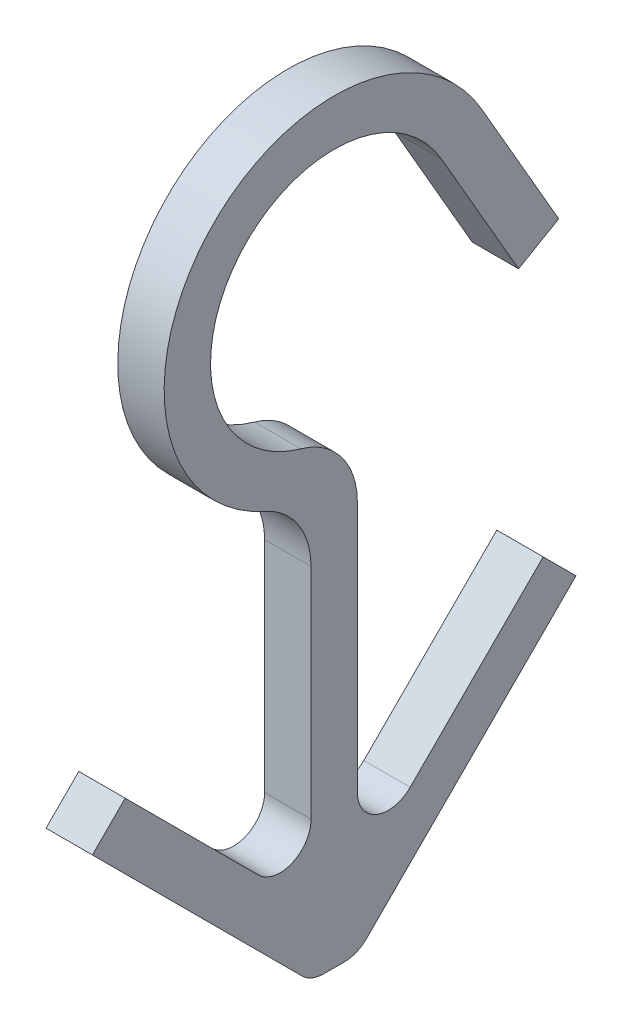
ISO-10303-21;
HEADER;
FILE_DESCRIPTION(('STEP AP214'),'2;1');
FILE_NAME('part.step','',(''),(''),'','','');
FILE_SCHEMA(('AUTOMOTIVE_DESIGN { 1 0 10303 214 1 1 1 1 }'));
ENDSEC;
DATA;
#1=APPLICATION_CONTEXT('core data for automotive mechanical design processes');
#2=APPLICATION_PROTOCOL_DEFINITION('international standard','automotive_design',2000,#1);
#3=PRODUCT_CONTEXT('',#1,'mechanical');
#4=PRODUCT('Part','Part','',(#3));
#5=PRODUCT_RELATED_PRODUCT_CATEGORY('part','',(#4));
#6=PRODUCT_DEFINITION_FORMATION('','',#4);
#7=PRODUCT_DEFINITION_CONTEXT('part definition',#1,'design');
#8=PRODUCT_DEFINITION('design','',#6,#7);
#9=PRODUCT_DEFINITION_SHAPE('','',#8);
#10=(LENGTH_UNIT() NAMED_UNIT(*) SI_UNIT(.MILLI.,.METRE.));
#11=(NAMED_UNIT(*) PLANE_ANGLE_UNIT() SI_UNIT($,.RADIAN.));
#12=(NAMED_UNIT(*) SI_UNIT($,.STERADIAN.) SOLID_ANGLE_UNIT());
#13=UNCERTAINTY_MEASURE_WITH_UNIT(LENGTH_MEASURE(1.E-05),#10,'distance_accuracy_value','');
#14=(GEOMETRIC_REPRESENTATION_CONTEXT(3) GLOBAL_UNCERTAINTY_ASSIGNED_CONTEXT((#13)) GLOBAL_UNIT_ASSIGNED_CONTEXT((#10,
#11,#12)) REPRESENTATION_CONTEXT('',''));
#15=CARTESIAN_POINT('',(0.,0.,0.));
#16=DIRECTION('',(0.,0.,1.));
#17=DIRECTION('',(1.,0.,0.));
#18=AXIS2_PLACEMENT_3D('',#15,#16,#17);
#19=CARTESIAN_POINT('',(6.,0.,0.));
#20=DIRECTION('',(-1.,0.,0.));
#21=DIRECTION('',(0.,0.,1.));
#22=AXIS2_PLACEMENT_3D('',#19,#20,#21);
#23=CYLINDRICAL_SURFACE('',#22,22.);
#24=CARTESIAN_POINT('',(0.,0.,0.));
#25=DIRECTION('',(1.,0.,0.));
#26=DIRECTION('',(0.,0.,-1.));
#27=AXIS2_PLACEMENT_3D('',#24,#25,#26);
#28=CIRCLE('',#27,22.);
#29=CARTESIAN_POINT('',(0.,11.,-19.0525588832577));
#30=VERTEX_POINT('',#29);
#31=CARTESIAN_POINT('',(0.,-20.1027633361685,8.9375));
#32=VERTEX_POINT('',#31);
#33=EDGE_CURVE('E301',#30,#32,#28,.T.);
#34=ORIENTED_EDGE('',*,*,#33,.T.);
#35=DIRECTION('',(-1.,0.,0.));
#36=VECTOR('',#35,1.);
#37=CARTESIAN_POINT('',(6.,-20.1027633361685,8.9375));
#38=LINE('',#37,#36);
#39=CARTESIAN_POINT('',(6.,-20.1027633361685,8.9375));
#40=VERTEX_POINT('',#39);
#41=EDGE_CURVE('E309',#32,#40,#38,.F.);
#42=ORIENTED_EDGE('',*,*,#41,.T.);
#43=CARTESIAN_POINT('',(6.,0.,0.));
#44=DIRECTION('',(1.,0.,0.));
#45=DIRECTION('',(0.,0.,-1.));
#46=AXIS2_PLACEMENT_3D('',#43,#44,#45);
#47=CIRCLE('',#46,22.);
#48=CARTESIAN_POINT('',(6.,11.,-19.0525588832576));
#49=VERTEX_POINT('',#48);
#50=EDGE_CURVE('E305',#49,#40,#47,.T.);
#51=ORIENTED_EDGE('',*,*,#50,.F.);
#52=DIRECTION('',(1.,0.,0.));
#53=VECTOR('',#52,1.);
#54=CARTESIAN_POINT('',(-25.374122584008,11.,-19.0525588832577));
#55=LINE('',#54,#53);
#56=EDGE_CURVE('E270',#30,#49,#55,.T.);
#57=ORIENTED_EDGE('',*,*,#56,.F.);
#58=EDGE_LOOP('',(#34,#42,#51,#57));
#59=FACE_BOUND('',#58,.T.);
#60=ADVANCED_FACE('F41',(#59),#23,.T.);
#61=CARTESIAN_POINT('',(6.,0.,0.));
#62=DIRECTION('',(-1.,0.,0.));
#63=DIRECTION('',(0.,0.,1.));
#64=AXIS2_PLACEMENT_3D('',#61,#62,#63);
#65=CYLINDRICAL_SURFACE('',#64,16.);
#66=CARTESIAN_POINT('',(6.,0.,0.));
#67=DIRECTION('',(1.,0.,0.));
#68=DIRECTION('',(0.,0.,-1.));
#69=AXIS2_PLACEMENT_3D('',#66,#67,#68);
#70=CIRCLE('',#69,16.);
#71=CARTESIAN_POINT('',(6.,8.00000000000001,-13.856406460551));
#72=VERTEX_POINT('',#71);
#73=CARTESIAN_POINT('',(6.,-15.4092111083679,4.30769230769231));
#74=VERTEX_POINT('',#73);
#75=EDGE_CURVE('E297',#72,#74,#70,.T.);
#76=ORIENTED_EDGE('',*,*,#75,.T.);
#77=DIRECTION('',(-1.,0.,0.));
#78=VECTOR('',#77,1.);
#79=CARTESIAN_POINT('',(6.,-15.4092111083679,4.30769230769231));
#80=LINE('',#79,#78);
#81=CARTESIAN_POINT('',(0.,-15.4092111083679,4.30769230769231));
#82=VERTEX_POINT('',#81);
#83=EDGE_CURVE('E333',#74,#82,#80,.T.);
#84=ORIENTED_EDGE('',*,*,#83,.T.);
#85=CARTESIAN_POINT('',(0.,0.,0.));
#86=DIRECTION('',(1.,0.,0.));
#87=DIRECTION('',(0.,0.,-1.));
#88=AXIS2_PLACEMENT_3D('',#85,#86,#87);
#89=CIRCLE('',#88,16.);
#90=CARTESIAN_POINT('',(0.,8.00000000000001,-13.856406460551));
#91=VERTEX_POINT('',#90);
#92=EDGE_CURVE('E296',#91,#82,#89,.T.);
#93=ORIENTED_EDGE('',*,*,#92,.F.);
#94=DIRECTION('',(1.,0.,0.));
#95=VECTOR('',#94,1.);
#96=CARTESIAN_POINT('',(0.,8.00000000000001,-13.856406460551));
#97=LINE('',#96,#95);
#98=EDGE_CURVE('E256',#91,#72,#97,.T.);
#99=ORIENTED_EDGE('',*,*,#98,.T.);
#100=EDGE_LOOP('',(#76,#84,#93,#99));
#101=FACE_BOUND('',#100,.T.);
#102=ADVANCED_FACE('F407',(#101),#65,.F.);
#103=CARTESIAN_POINT('',(6.,0.,0.));
#104=DIRECTION('',(1.,0.,0.));
#105=DIRECTION('',(0.,0.,-1.));
#106=AXIS2_PLACEMENT_3D('',#103,#104,#105);
#107=PLANE('',#106);
#108=DIRECTION('',(0.,-0.707106781186552,-0.707106781186544));
#109=VECTOR('',#108,1.);
#110=CARTESIAN_POINT('',(6.,-39.3581168227504,39.3581168227509));
#111=LINE('',#110,#109);
#112=CARTESIAN_POINT('',(6.,-47.4319623980397,31.2842712474617));
#113=VERTEX_POINT('',#112);
#114=CARTESIAN_POINT('',(6.,-74.5446607702479,4.17157287525381));
#115=VERTEX_POINT('',#114);
#116=EDGE_CURVE('E233',#113,#115,#111,.T.);
#117=ORIENTED_EDGE('',*,*,#116,.T.);
#118=CARTESIAN_POINT('',(6.,-71.7162336455017,1.34314575050761));
#119=DIRECTION('',(1.,0.,0.));
#120=DIRECTION('',(0.,0.,-1.));
#121=AXIS2_PLACEMENT_3D('',#118,#119,#120);
#122=CIRCLE('',#121,4.);
#123=CARTESIAN_POINT('',(6.,-75.7162336455017,1.34314575050761));
#124=VERTEX_POINT('',#123);
#125=EDGE_CURVE('E370',#115,#124,#122,.T.);
#126=ORIENTED_EDGE('',*,*,#125,.T.);
#127=DIRECTION('',(0.,0.,1.));
#128=VECTOR('',#127,1.);
#129=CARTESIAN_POINT('',(6.,-75.7162336455017,0.));
#130=LINE('',#129,#128);
#131=CARTESIAN_POINT('',(6.,-75.7162336455017,-1.3431457505076));
#132=VERTEX_POINT('',#131);
#133=EDGE_CURVE('E221',#132,#124,#130,.T.);
#134=ORIENTED_EDGE('',*,*,#133,.F.);
#135=CARTESIAN_POINT('',(6.,-71.7162336455017,-1.3431457505076));
#136=DIRECTION('',(1.,0.,0.));
#137=DIRECTION('',(0.,0.,-1.));
#138=AXIS2_PLACEMENT_3D('',#135,#136,#137);
#139=CIRCLE('',#138,4.);
#140=CARTESIAN_POINT('',(6.,-74.5446607702479,-4.17157287525381));
#141=VERTEX_POINT('',#140);
#142=EDGE_CURVE('E57',#132,#141,#139,.T.);
#143=ORIENTED_EDGE('',*,*,#142,.T.);
#144=DIRECTION('',(0.,-0.707106781186552,0.707106781186544));
#145=VECTOR('',#144,1.);
#146=CARTESIAN_POINT('',(6.,-39.3581168227504,-39.3581168227509));
#147=LINE('',#146,#145);
#148=CARTESIAN_POINT('',(6.,-47.4319623980397,-31.2842712474617));
#149=VERTEX_POINT('',#148);
#150=EDGE_CURVE('E192',#149,#141,#147,.T.);
#151=ORIENTED_EDGE('',*,*,#150,.F.);
#152=DIRECTION('',(0.,-0.707106781186543,-0.707106781186552));
#153=VECTOR('',#152,1.);
#154=CARTESIAN_POINT('',(6.,-8.07384557528928,8.07384557528917));
#155=LINE('',#154,#153);
#156=CARTESIAN_POINT('',(6.,-43.1893217109204,-27.0416305603424));
#157=VERTEX_POINT('',#156);
#158=EDGE_CURVE('E182',#157,#149,#155,.T.);
#159=ORIENTED_EDGE('',*,*,#158,.F.);
#160=DIRECTION('',(0.,0.707106781186552,-0.707106781186544));
#161=VECTOR('',#160,1.);
#162=CARTESIAN_POINT('',(6.,-35.1154761356312,-35.1154761356316));
#163=LINE('',#162,#161);
#164=CARTESIAN_POINT('',(6.,-60.4025251465168,-9.82842712474621));
#165=VERTEX_POINT('',#164);
#166=EDGE_CURVE('E202',#165,#157,#163,.T.);
#167=ORIENTED_EDGE('',*,*,#166,.F.);
#168=CARTESIAN_POINT('',(6.,-57.5740980217706,-7.00000000000001));
#169=DIRECTION('',(1.,0.,0.));
#170=DIRECTION('',(0.,0.,-1.));
#171=AXIS2_PLACEMENT_3D('',#168,#169,#170);
#172=CIRCLE('',#171,4.);
#173=CARTESIAN_POINT('',(6.,-57.5740980217706,-3.));
#174=VERTEX_POINT('',#173);
#175=EDGE_CURVE('E11',#165,#174,#172,.F.);
#176=ORIENTED_EDGE('',*,*,#175,.T.);
#177=DIRECTION('',(0.,1.,0.));
#178=VECTOR('',#177,1.);
#179=CARTESIAN_POINT('',(6.,-15.7162336455017,-3.));
#180=LINE('',#179,#178);
#181=CARTESIAN_POINT('',(6.,-25.0399680510978,-3.));
#182=VERTEX_POINT('',#181);
#183=EDGE_CURVE('E253',#174,#182,#180,.T.);
#184=ORIENTED_EDGE('',*,*,#183,.T.);
#185=CARTESIAN_POINT('',(6.,-25.0399680510978,7.));
#186=DIRECTION('',(1.,0.,0.));
#187=DIRECTION('',(0.,0.,-1.));
#188=AXIS2_PLACEMENT_3D('',#185,#186,#187);
#189=CIRCLE('',#188,10.);
#190=EDGE_CURVE('E330',#182,#74,#189,.T.);
#191=ORIENTED_EDGE('',*,*,#190,.T.);
#192=ORIENTED_EDGE('',*,*,#75,.F.);
#193=DIRECTION('',(0.,-0.866025403784438,-0.500000000000001));
#194=VECTOR('',#193,1.);
#195=CARTESIAN_POINT('',(6.,-9.32050807568874,-23.856406460551));
#196=LINE('',#195,#194);
#197=CARTESIAN_POINT('',(6.,-9.32050807568874,-23.856406460551));
#198=VERTEX_POINT('',#197);
#199=EDGE_CURVE('E265',#72,#198,#196,.T.);
#200=ORIENTED_EDGE('',*,*,#199,.T.);
#201=DIRECTION('',(0.,0.500000000000001,-0.866025403784438));
#202=VECTOR('',#201,1.);
#203=CARTESIAN_POINT('',(6.,-6.32050807568872,-29.0525588832577));
#204=LINE('',#203,#202);
#205=CARTESIAN_POINT('',(6.,-6.32050807568872,-29.0525588832577));
#206=VERTEX_POINT('',#205);
#207=EDGE_CURVE('E276',#198,#206,#204,.T.);
#208=ORIENTED_EDGE('',*,*,#207,.T.);
#209=DIRECTION('',(0.,0.866025403784438,0.500000000000001));
#210=VECTOR('',#209,1.);
#211=CARTESIAN_POINT('',(6.,11.,-19.0525588832577));
#212=LINE('',#211,#210);
#213=EDGE_CURVE('E280',#206,#49,#212,.T.);
#214=ORIENTED_EDGE('',*,*,#213,.T.);
#215=ORIENTED_EDGE('',*,*,#50,.T.);
#216=CARTESIAN_POINT('',(6.,-29.2403830344269,13.));
#217=DIRECTION('',(1.,0.,0.));
#218=DIRECTION('',(0.,0.,-1.));
#219=AXIS2_PLACEMENT_3D('',#216,#217,#218);
#220=CIRCLE('',#219,10.);
#221=CARTESIAN_POINT('',(6.,-29.2403830344269,3.));
#222=VERTEX_POINT('',#221);
#223=EDGE_CURVE('E320',#40,#222,#220,.F.);
#224=ORIENTED_EDGE('',*,*,#223,.T.);
#225=DIRECTION('',(0.,-1.,0.));
#226=VECTOR('',#225,1.);
#227=CARTESIAN_POINT('',(6.,-15.7162336455017,3.));
#228=LINE('',#227,#226);
#229=CARTESIAN_POINT('',(6.,-57.5740980217706,3.));
#230=VERTEX_POINT('',#229);
#231=EDGE_CURVE('E232',#222,#230,#228,.T.);
#232=ORIENTED_EDGE('',*,*,#231,.T.);
#233=CARTESIAN_POINT('',(6.,-57.5740980217706,7.00000000000001));
#234=DIRECTION('',(1.,0.,0.));
#235=DIRECTION('',(0.,0.,-1.));
#236=AXIS2_PLACEMENT_3D('',#233,#234,#235);
#237=CIRCLE('',#236,4.);
#238=CARTESIAN_POINT('',(6.,-60.4025251465168,9.82842712474621));
#239=VERTEX_POINT('',#238);
#240=EDGE_CURVE('E379',#230,#239,#237,.F.);
#241=ORIENTED_EDGE('',*,*,#240,.T.);
#242=DIRECTION('',(0.,0.707106781186552,0.707106781186544));
#243=VECTOR('',#242,1.);
#244=CARTESIAN_POINT('',(6.,-35.1154761356312,35.1154761356316));
#245=LINE('',#244,#243);
#246=CARTESIAN_POINT('',(6.,-43.1893217109204,27.0416305603424));
#247=VERTEX_POINT('',#246);
#248=EDGE_CURVE('E229',#239,#247,#245,.T.);
#249=ORIENTED_EDGE('',*,*,#248,.T.);
#250=DIRECTION('',(0.,-0.707106781186543,0.707106781186552));
#251=VECTOR('',#250,1.);
#252=CARTESIAN_POINT('',(6.,-8.07384557528928,-8.07384557528917));
#253=LINE('',#252,#251);
#254=EDGE_CURVE('E215',#247,#113,#253,.T.);
#255=ORIENTED_EDGE('',*,*,#254,.T.);
#256=EDGE_LOOP('',(#117,#126,#134,#143,#151,#159,#167,#176,#184,#191,#192,#200,#208,#214,#215,
#224,#232,#241,#249,#255));
#257=FACE_BOUND('',#256,.T.);
#258=ADVANCED_FACE('F204',(#257),#107,.T.);
#259=CARTESIAN_POINT('',(0.,0.,0.));
#260=DIRECTION('',(1.,0.,0.));
#261=DIRECTION('',(0.,0.,-1.));
#262=AXIS2_PLACEMENT_3D('',#259,#260,#261);
#263=PLANE('',#262);
#264=DIRECTION('',(0.,0.,1.));
#265=VECTOR('',#264,1.);
#266=CARTESIAN_POINT('',(0.,-75.7162336455017,0.));
#267=LINE('',#266,#265);
#268=CARTESIAN_POINT('',(0.,-75.7162336455017,-1.3431457505076));
#269=VERTEX_POINT('',#268);
#270=CARTESIAN_POINT('',(0.,-75.7162336455017,1.34314575050761));
#271=VERTEX_POINT('',#270);
#272=EDGE_CURVE('E211',#269,#271,#267,.T.);
#273=ORIENTED_EDGE('',*,*,#272,.T.);
#274=CARTESIAN_POINT('',(0.,-71.7162336455017,1.34314575050761));
#275=DIRECTION('',(1.,0.,0.));
#276=DIRECTION('',(0.,0.,-1.));
#277=AXIS2_PLACEMENT_3D('',#274,#275,#276);
#278=CIRCLE('',#277,4.);
#279=CARTESIAN_POINT('',(0.,-74.5446607702479,4.17157287525381));
#280=VERTEX_POINT('',#279);
#281=EDGE_CURVE('E363',#271,#280,#278,.F.);
#282=ORIENTED_EDGE('',*,*,#281,.T.);
#283=DIRECTION('',(0.,-0.707106781186552,-0.707106781186544));
#284=VECTOR('',#283,1.);
#285=CARTESIAN_POINT('',(0.,-39.3581168227504,39.3581168227509));
#286=LINE('',#285,#284);
#287=CARTESIAN_POINT('',(0.,-47.4319623980397,31.2842712474617));
#288=VERTEX_POINT('',#287);
#289=EDGE_CURVE('E225',#288,#280,#286,.T.);
#290=ORIENTED_EDGE('',*,*,#289,.F.);
#291=DIRECTION('',(0.,-0.707106781186543,0.707106781186552));
#292=VECTOR('',#291,1.);
#293=CARTESIAN_POINT('',(0.,-8.07384557528928,-8.07384557528917));
#294=LINE('',#293,#292);
#295=CARTESIAN_POINT('',(0.,-43.1893217109204,27.0416305603424));
#296=VERTEX_POINT('',#295);
#297=EDGE_CURVE('E216',#296,#288,#294,.T.);
#298=ORIENTED_EDGE('',*,*,#297,.F.);
#299=DIRECTION('',(0.,0.707106781186552,0.707106781186544));
#300=VECTOR('',#299,1.);
#301=CARTESIAN_POINT('',(0.,-35.1154761356312,35.1154761356316));
#302=LINE('',#301,#300);
#303=CARTESIAN_POINT('',(0.,-60.4025251465168,9.82842712474621));
#304=VERTEX_POINT('',#303);
#305=EDGE_CURVE('E217',#304,#296,#302,.T.);
#306=ORIENTED_EDGE('',*,*,#305,.F.);
#307=CARTESIAN_POINT('',(0.,-57.5740980217706,7.00000000000001));
#308=DIRECTION('',(1.,0.,0.));
#309=DIRECTION('',(0.,0.,-1.));
#310=AXIS2_PLACEMENT_3D('',#307,#308,#309);
#311=CIRCLE('',#310,4.);
#312=CARTESIAN_POINT('',(0.,-57.5740980217706,3.));
#313=VERTEX_POINT('',#312);
#314=EDGE_CURVE('E376',#304,#313,#311,.T.);
#315=ORIENTED_EDGE('',*,*,#314,.T.);
#316=DIRECTION('',(0.,1.,0.));
#317=VECTOR('',#316,1.);
#318=CARTESIAN_POINT('',(0.,-15.7162336455017,3.));
#319=LINE('',#318,#317);
#320=CARTESIAN_POINT('',(0.,-29.2403830344269,3.));
#321=VERTEX_POINT('',#320);
#322=EDGE_CURVE('E252',#313,#321,#319,.T.);
#323=ORIENTED_EDGE('',*,*,#322,.T.);
#324=CARTESIAN_POINT('',(0.,-29.2403830344269,13.));
#325=DIRECTION('',(1.,0.,0.));
#326=DIRECTION('',(0.,0.,-1.));
#327=AXIS2_PLACEMENT_3D('',#324,#325,#326);
#328=CIRCLE('',#327,10.);
#329=EDGE_CURVE('E323',#321,#32,#328,.T.);
#330=ORIENTED_EDGE('',*,*,#329,.T.);
#331=ORIENTED_EDGE('',*,*,#33,.F.);
#332=DIRECTION('',(0.,-0.866025403784438,-0.500000000000001));
#333=VECTOR('',#332,1.);
#334=CARTESIAN_POINT('',(0.,11.,-19.0525588832577));
#335=LINE('',#334,#333);
#336=CARTESIAN_POINT('',(0.,-6.32050807568872,-29.0525588832577));
#337=VERTEX_POINT('',#336);
#338=EDGE_CURVE('E269',#30,#337,#335,.T.);
#339=ORIENTED_EDGE('',*,*,#338,.T.);
#340=DIRECTION('',(0.,-0.500000000000001,0.866025403784438));
#341=VECTOR('',#340,1.);
#342=CARTESIAN_POINT('',(0.,-6.32050807568872,-29.0525588832577));
#343=LINE('',#342,#341);
#344=CARTESIAN_POINT('',(0.,-9.32050807568874,-23.856406460551));
#345=VERTEX_POINT('',#344);
#346=EDGE_CURVE('E266',#337,#345,#343,.T.);
#347=ORIENTED_EDGE('',*,*,#346,.T.);
#348=DIRECTION('',(0.,0.866025403784438,0.500000000000001));
#349=VECTOR('',#348,1.);
#350=CARTESIAN_POINT('',(0.,-9.32050807568874,-23.856406460551));
#351=LINE('',#350,#349);
#352=EDGE_CURVE('E273',#345,#91,#351,.T.);
#353=ORIENTED_EDGE('',*,*,#352,.T.);
#354=ORIENTED_EDGE('',*,*,#92,.T.);
#355=CARTESIAN_POINT('',(0.,-25.0399680510978,7.));
#356=DIRECTION('',(1.,0.,0.));
#357=DIRECTION('',(0.,0.,-1.));
#358=AXIS2_PLACEMENT_3D('',#355,#356,#357);
#359=CIRCLE('',#358,10.);
#360=CARTESIAN_POINT('',(0.,-25.0399680510978,-3.));
#361=VERTEX_POINT('',#360);
#362=EDGE_CURVE('E336',#82,#361,#359,.F.);
#363=ORIENTED_EDGE('',*,*,#362,.T.);
#364=DIRECTION('',(0.,-1.,0.));
#365=VECTOR('',#364,1.);
#366=CARTESIAN_POINT('',(0.,-15.7162336455017,-3.));
#367=LINE('',#366,#365);
#368=CARTESIAN_POINT('',(0.,-57.5740980217706,-3.));
#369=VERTEX_POINT('',#368);
#370=EDGE_CURVE('E248',#361,#369,#367,.T.);
#371=ORIENTED_EDGE('',*,*,#370,.T.);
#372=CARTESIAN_POINT('',(0.,-57.5740980217706,-7.00000000000001));
#373=DIRECTION('',(1.,0.,0.));
#374=DIRECTION('',(0.,0.,-1.));
#375=AXIS2_PLACEMENT_3D('',#372,#373,#374);
#376=CIRCLE('',#375,4.);
#377=CARTESIAN_POINT('',(0.,-60.4025251465168,-9.82842712474621));
#378=VERTEX_POINT('',#377);
#379=EDGE_CURVE('E50',#369,#378,#376,.T.);
#380=ORIENTED_EDGE('',*,*,#379,.T.);
#381=DIRECTION('',(0.,0.707106781186552,-0.707106781186544));
#382=VECTOR('',#381,1.);
#383=CARTESIAN_POINT('',(0.,-35.1154761356312,-35.1154761356316));
#384=LINE('',#383,#382);
#385=CARTESIAN_POINT('',(0.,-43.1893217109204,-27.0416305603424));
#386=VERTEX_POINT('',#385);
#387=EDGE_CURVE('E385',#378,#386,#384,.T.);
#388=ORIENTED_EDGE('',*,*,#387,.T.);
#389=DIRECTION('',(0.,-0.707106781186543,-0.707106781186552));
#390=VECTOR('',#389,1.);
#391=CARTESIAN_POINT('',(0.,-8.07384557528928,8.07384557528917));
#392=LINE('',#391,#390);
#393=CARTESIAN_POINT('',(0.,-47.4319623980397,-31.2842712474617));
#394=VERTEX_POINT('',#393);
#395=EDGE_CURVE('E247',#386,#394,#392,.T.);
#396=ORIENTED_EDGE('',*,*,#395,.T.);
#397=DIRECTION('',(0.,-0.707106781186552,0.707106781186544));
#398=VECTOR('',#397,1.);
#399=CARTESIAN_POINT('',(0.,-39.3581168227504,-39.3581168227509));
#400=LINE('',#399,#398);
#401=CARTESIAN_POINT('',(0.,-74.5446607702479,-4.17157287525381));
#402=VERTEX_POINT('',#401);
#403=EDGE_CURVE('E199',#394,#402,#400,.T.);
#404=ORIENTED_EDGE('',*,*,#403,.T.);
#405=CARTESIAN_POINT('',(0.,-71.7162336455017,-1.3431457505076));
#406=DIRECTION('',(1.,0.,0.));
#407=DIRECTION('',(0.,0.,-1.));
#408=AXIS2_PLACEMENT_3D('',#405,#406,#407);
#409=CIRCLE('',#408,4.);
#410=EDGE_CURVE('E360',#402,#269,#409,.F.);
#411=ORIENTED_EDGE('',*,*,#410,.T.);
#412=EDGE_LOOP('',(#273,#282,#290,#298,#306,#315,#323,#330,#331,#339,#347,#353,#354,#363,#371,
#380,#388,#396,#404,#411));
#413=FACE_BOUND('',#412,.T.);
#414=ADVANCED_FACE('F384',(#413),#263,.F.);
#415=CARTESIAN_POINT('',(-25.374122584008,-9.32050807568874,-23.856406460551));
#416=DIRECTION('',(0.,-0.500000000000001,0.866025403784438));
#417=DIRECTION('',(0.,-0.866025403784438,-0.500000000000001));
#418=AXIS2_PLACEMENT_3D('',#415,#416,#417);
#419=PLANE('',#418);
#420=ORIENTED_EDGE('',*,*,#199,.F.);
#421=ORIENTED_EDGE('',*,*,#98,.F.);
#422=ORIENTED_EDGE('',*,*,#352,.F.);
#423=DIRECTION('',(1.,0.,0.));
#424=VECTOR('',#423,1.);
#425=CARTESIAN_POINT('',(-25.374122584008,-9.32050807568874,-23.856406460551));
#426=LINE('',#425,#424);
#427=EDGE_CURVE('E284',#345,#198,#426,.T.);
#428=ORIENTED_EDGE('',*,*,#427,.T.);
#429=EDGE_LOOP('',(#420,#421,#422,#428));
#430=FACE_BOUND('',#429,.T.);
#431=ADVANCED_FACE('F412',(#430),#419,.T.);
#432=CARTESIAN_POINT('',(-25.374122584008,11.,-19.0525588832577));
#433=DIRECTION('',(0.,0.500000000000001,-0.866025403784438));
#434=DIRECTION('',(0.,0.866025403784438,0.500000000000001));
#435=AXIS2_PLACEMENT_3D('',#432,#433,#434);
#436=PLANE('',#435);
#437=ORIENTED_EDGE('',*,*,#338,.F.);
#438=ORIENTED_EDGE('',*,*,#56,.T.);
#439=ORIENTED_EDGE('',*,*,#213,.F.);
#440=DIRECTION('',(1.,0.,0.));
#441=VECTOR('',#440,1.);
#442=CARTESIAN_POINT('',(-25.374122584008,-6.32050807568872,-29.0525588832577));
#443=LINE('',#442,#441);
#444=EDGE_CURVE('E288',#337,#206,#443,.T.);
#445=ORIENTED_EDGE('',*,*,#444,.F.);
#446=EDGE_LOOP('',(#437,#438,#439,#445));
#447=FACE_BOUND('',#446,.T.);
#448=ADVANCED_FACE('F420',(#447),#436,.T.);
#449=CARTESIAN_POINT('',(-25.374122584008,-6.32050807568872,-29.0525588832577));
#450=DIRECTION('',(0.,-0.866025403784438,-0.500000000000001));
#451=DIRECTION('',(0.,0.500000000000001,-0.866025403784438));
#452=AXIS2_PLACEMENT_3D('',#449,#450,#451);
#453=PLANE('',#452);
#454=ORIENTED_EDGE('',*,*,#346,.F.);
#455=ORIENTED_EDGE('',*,*,#444,.T.);
#456=ORIENTED_EDGE('',*,*,#207,.F.);
#457=ORIENTED_EDGE('',*,*,#427,.F.);
#458=EDGE_LOOP('',(#454,#455,#456,#457));
#459=FACE_BOUND('',#458,.T.);
#460=ADVANCED_FACE('F543',(#459),#453,.T.);
#461=CARTESIAN_POINT('',(-30.5941170815567,-15.7162336455017,3.));
#462=DIRECTION('',(0.,0.,1.));
#463=DIRECTION('',(0.,-1.,0.));
#464=AXIS2_PLACEMENT_3D('',#461,#462,#463);
#465=PLANE('',#464);
#466=ORIENTED_EDGE('',*,*,#322,.F.);
#467=DIRECTION('',(-1.,0.,0.));
#468=VECTOR('',#467,1.);
#469=CARTESIAN_POINT('',(-30.5941170815567,-57.5740980217706,3.));
#470=LINE('',#469,#468);
#471=EDGE_CURVE('E343',#313,#230,#470,.F.);
#472=ORIENTED_EDGE('',*,*,#471,.T.);
#473=ORIENTED_EDGE('',*,*,#231,.F.);
#474=DIRECTION('',(-1.,0.,0.));
#475=VECTOR('',#474,1.);
#476=CARTESIAN_POINT('',(-30.5941170815567,-29.2403830344269,3.));
#477=LINE('',#476,#475);
#478=EDGE_CURVE('E316',#222,#321,#477,.T.);
#479=ORIENTED_EDGE('',*,*,#478,.T.);
#480=EDGE_LOOP('',(#466,#472,#473,#479));
#481=FACE_BOUND('',#480,.T.);
#482=ADVANCED_FACE('F430',(#481),#465,.T.);
#483=CARTESIAN_POINT('',(-30.5941170815567,-15.7162336455017,-3.));
#484=DIRECTION('',(0.,0.,-1.));
#485=DIRECTION('',(0.,1.,0.));
#486=AXIS2_PLACEMENT_3D('',#483,#484,#485);
#487=PLANE('',#486);
#488=ORIENTED_EDGE('',*,*,#183,.F.);
#489=DIRECTION('',(-1.,0.,0.));
#490=VECTOR('',#489,1.);
#491=CARTESIAN_POINT('',(0.,-57.5740980217706,-3.00000000000001));
#492=LINE('',#491,#490);
#493=EDGE_CURVE('E346',#174,#369,#492,.T.);
#494=ORIENTED_EDGE('',*,*,#493,.T.);
#495=ORIENTED_EDGE('',*,*,#370,.F.);
#496=DIRECTION('',(-1.,0.,0.));
#497=VECTOR('',#496,1.);
#498=CARTESIAN_POINT('',(-30.5941170815567,-25.0399680510978,-3.));
#499=LINE('',#498,#497);
#500=EDGE_CURVE('E326',#361,#182,#499,.F.);
#501=ORIENTED_EDGE('',*,*,#500,.T.);
#502=EDGE_LOOP('',(#488,#494,#495,#501));
#503=FACE_BOUND('',#502,.T.);
#504=ADVANCED_FACE('F399',(#503),#487,.T.);
#505=CARTESIAN_POINT('',(6.,-29.2403830344269,13.));
#506=DIRECTION('',(-1.,0.,0.));
#507=DIRECTION('',(0.,0.,1.));
#508=AXIS2_PLACEMENT_3D('',#505,#506,#507);
#509=CYLINDRICAL_SURFACE('',#508,10.);
#510=ORIENTED_EDGE('',*,*,#329,.F.);
#511=ORIENTED_EDGE('',*,*,#478,.F.);
#512=ORIENTED_EDGE('',*,*,#223,.F.);
#513=ORIENTED_EDGE('',*,*,#41,.F.);
#514=EDGE_LOOP('',(#510,#511,#512,#513));
#515=FACE_BOUND('',#514,.T.);
#516=ADVANCED_FACE('F433',(#515),#509,.F.);
#517=CARTESIAN_POINT('',(6.,-25.0399680510978,7.));
#518=DIRECTION('',(-1.,0.,0.));
#519=DIRECTION('',(0.,0.,1.));
#520=AXIS2_PLACEMENT_3D('',#517,#518,#519);
#521=CYLINDRICAL_SURFACE('',#520,10.);
#522=ORIENTED_EDGE('',*,*,#362,.F.);
#523=ORIENTED_EDGE('',*,*,#83,.F.);
#524=ORIENTED_EDGE('',*,*,#190,.F.);
#525=ORIENTED_EDGE('',*,*,#500,.F.);
#526=EDGE_LOOP('',(#522,#523,#524,#525));
#527=FACE_BOUND('',#526,.T.);
#528=ADVANCED_FACE('F403',(#527),#521,.T.);
#529=CARTESIAN_POINT('',(53.2589806806023,-39.3581168227504,39.3581168227509));
#530=DIRECTION('',(0.,0.707106781186544,-0.707106781186552));
#531=DIRECTION('',(0.,0.707106781186552,0.707106781186544));
#532=AXIS2_PLACEMENT_3D('',#529,#530,#531);
#533=PLANE('',#532);
#534=ORIENTED_EDGE('',*,*,#289,.T.);
#535=DIRECTION('',(-1.,0.,0.));
#536=VECTOR('',#535,1.);
#537=CARTESIAN_POINT('',(6.,-74.5446607702479,4.17157287525382));
#538=LINE('',#537,#536);
#539=EDGE_CURVE('E65',#280,#115,#538,.F.);
#540=ORIENTED_EDGE('',*,*,#539,.T.);
#541=ORIENTED_EDGE('',*,*,#116,.F.);
#542=DIRECTION('',(-1.,0.,0.));
#543=VECTOR('',#542,1.);
#544=CARTESIAN_POINT('',(53.2589806806023,-47.4319623980397,31.2842712474617));
#545=LINE('',#544,#543);
#546=EDGE_CURVE('E228',#113,#288,#545,.T.);
#547=ORIENTED_EDGE('',*,*,#546,.T.);
#548=EDGE_LOOP('',(#534,#540,#541,#547));
#549=FACE_BOUND('',#548,.T.);
#550=ADVANCED_FACE('F473',(#549),#533,.F.);
#551=CARTESIAN_POINT('',(53.2589806806023,-75.7162336455017,0.));
#552=DIRECTION('',(0.,-1.,0.));
#553=DIRECTION('',(0.,0.,-1.));
#554=AXIS2_PLACEMENT_3D('',#551,#552,#553);
#555=PLANE('',#554);
#556=ORIENTED_EDGE('',*,*,#133,.T.);
#557=DIRECTION('',(-1.,0.,0.));
#558=VECTOR('',#557,1.);
#559=CARTESIAN_POINT('',(0.,-75.7162336455017,1.34314575050761));
#560=LINE('',#559,#558);
#561=EDGE_CURVE('E356',#124,#271,#560,.T.);
#562=ORIENTED_EDGE('',*,*,#561,.T.);
#563=ORIENTED_EDGE('',*,*,#272,.F.);
#564=DIRECTION('',(-1.,0.,0.));
#565=VECTOR('',#564,1.);
#566=CARTESIAN_POINT('',(53.2589806806023,-75.7162336455017,-1.3431457505076));
#567=LINE('',#566,#565);
#568=EDGE_CURVE('E353',#269,#132,#567,.F.);
#569=ORIENTED_EDGE('',*,*,#568,.T.);
#570=EDGE_LOOP('',(#556,#562,#563,#569));
#571=FACE_BOUND('',#570,.T.);
#572=ADVANCED_FACE('F452',(#571),#555,.T.);
#573=CARTESIAN_POINT('',(53.2589806806023,-35.1154761356312,35.1154761356316));
#574=DIRECTION('',(0.,-0.707106781186544,0.707106781186552));
#575=DIRECTION('',(0.,-0.707106781186552,-0.707106781186544));
#576=AXIS2_PLACEMENT_3D('',#573,#574,#575);
#577=PLANE('',#576);
#578=ORIENTED_EDGE('',*,*,#248,.F.);
#579=DIRECTION('',(-1.,0.,0.));
#580=VECTOR('',#579,1.);
#581=CARTESIAN_POINT('',(53.2589806806023,-60.4025251465168,9.82842712474621));
#582=LINE('',#581,#580);
#583=EDGE_CURVE('E339',#239,#304,#582,.T.);
#584=ORIENTED_EDGE('',*,*,#583,.T.);
#585=ORIENTED_EDGE('',*,*,#305,.T.);
#586=DIRECTION('',(-1.,0.,0.));
#587=VECTOR('',#586,1.);
#588=CARTESIAN_POINT('',(53.2589806806023,-43.1893217109204,27.0416305603424));
#589=LINE('',#588,#587);
#590=EDGE_CURVE('E220',#247,#296,#589,.T.);
#591=ORIENTED_EDGE('',*,*,#590,.F.);
#592=EDGE_LOOP('',(#578,#584,#585,#591));
#593=FACE_BOUND('',#592,.T.);
#594=ADVANCED_FACE('F441',(#593),#577,.F.);
#595=CARTESIAN_POINT('',(53.2589806806023,-8.07384557528928,-8.07384557528917));
#596=DIRECTION('',(0.,-0.707106781186552,-0.707106781186543));
#597=DIRECTION('',(0.,0.707106781186543,-0.707106781186552));
#598=AXIS2_PLACEMENT_3D('',#595,#596,#597);
#599=PLANE('',#598);
#600=ORIENTED_EDGE('',*,*,#254,.F.);
#601=ORIENTED_EDGE('',*,*,#590,.T.);
#602=ORIENTED_EDGE('',*,*,#297,.T.);
#603=ORIENTED_EDGE('',*,*,#546,.F.);
#604=EDGE_LOOP('',(#600,#601,#602,#603));
#605=FACE_BOUND('',#604,.T.);
#606=ADVANCED_FACE('F445',(#605),#599,.F.);
#607=CARTESIAN_POINT('',(53.2589806806023,-39.3581168227504,-39.3581168227509));
#608=DIRECTION('',(0.,-0.707106781186544,-0.707106781186552));
#609=DIRECTION('',(0.,0.707106781186552,-0.707106781186544));
#610=AXIS2_PLACEMENT_3D('',#607,#608,#609);
#611=PLANE('',#610);
#612=ORIENTED_EDGE('',*,*,#150,.T.);
#613=DIRECTION('',(-1.,0.,0.));
#614=VECTOR('',#613,1.);
#615=CARTESIAN_POINT('',(53.2589806806023,-74.5446607702479,-4.17157287525381));
#616=LINE('',#615,#614);
#617=EDGE_CURVE('E373',#141,#402,#616,.T.);
#618=ORIENTED_EDGE('',*,*,#617,.T.);
#619=ORIENTED_EDGE('',*,*,#403,.F.);
#620=DIRECTION('',(-1.,0.,0.));
#621=VECTOR('',#620,1.);
#622=CARTESIAN_POINT('',(53.2589806806023,-47.4319623980397,-31.2842712474617));
#623=LINE('',#622,#621);
#624=EDGE_CURVE('E186',#149,#394,#623,.T.);
#625=ORIENTED_EDGE('',*,*,#624,.F.);
#626=EDGE_LOOP('',(#612,#618,#619,#625));
#627=FACE_BOUND('',#626,.T.);
#628=ADVANCED_FACE('F195',(#627),#611,.T.);
#629=CARTESIAN_POINT('',(53.2589806806023,-8.07384557528928,8.07384557528917));
#630=DIRECTION('',(0.,0.707106781186552,-0.707106781186543));
#631=DIRECTION('',(0.,0.707106781186543,0.707106781186552));
#632=AXIS2_PLACEMENT_3D('',#629,#630,#631);
#633=PLANE('',#632);
#634=DIRECTION('',(-1.,0.,0.));
#635=VECTOR('',#634,1.);
#636=CARTESIAN_POINT('',(53.2589806806023,-43.1893217109204,-27.0416305603424));
#637=LINE('',#636,#635);
#638=EDGE_CURVE('E189',#157,#386,#637,.T.);
#639=ORIENTED_EDGE('',*,*,#638,.F.);
#640=ORIENTED_EDGE('',*,*,#158,.T.);
#641=ORIENTED_EDGE('',*,*,#624,.T.);
#642=ORIENTED_EDGE('',*,*,#395,.F.);
#643=EDGE_LOOP('',(#639,#640,#641,#642));
#644=FACE_BOUND('',#643,.T.);
#645=ADVANCED_FACE('F184',(#644),#633,.T.);
#646=CARTESIAN_POINT('',(53.2589806806023,-35.1154761356312,-35.1154761356316));
#647=DIRECTION('',(0.,0.707106781186544,0.707106781186552));
#648=DIRECTION('',(0.,-0.707106781186552,0.707106781186544));
#649=AXIS2_PLACEMENT_3D('',#646,#647,#648);
#650=PLANE('',#649);
#651=ORIENTED_EDGE('',*,*,#387,.F.);
#652=DIRECTION('',(-1.,0.,0.));
#653=VECTOR('',#652,1.);
#654=CARTESIAN_POINT('',(6.,-60.4025251465168,-9.82842712474621));
#655=LINE('',#654,#653);
#656=EDGE_CURVE('E350',#378,#165,#655,.F.);
#657=ORIENTED_EDGE('',*,*,#656,.T.);
#658=ORIENTED_EDGE('',*,*,#166,.T.);
#659=ORIENTED_EDGE('',*,*,#638,.T.);
#660=EDGE_LOOP('',(#651,#657,#658,#659));
#661=FACE_BOUND('',#660,.T.);
#662=ADVANCED_FACE('F391',(#661),#650,.T.);
#663=CARTESIAN_POINT('',(53.2589806806023,-57.5740980217706,7.00000000000001));
#664=DIRECTION('',(-1.,0.,0.));
#665=DIRECTION('',(0.,0.,1.));
#666=AXIS2_PLACEMENT_3D('',#663,#664,#665);
#667=CYLINDRICAL_SURFACE('',#666,4.);
#668=ORIENTED_EDGE('',*,*,#240,.F.);
#669=ORIENTED_EDGE('',*,*,#471,.F.);
#670=ORIENTED_EDGE('',*,*,#314,.F.);
#671=ORIENTED_EDGE('',*,*,#583,.F.);
#672=EDGE_LOOP('',(#668,#669,#670,#671));
#673=FACE_BOUND('',#672,.T.);
#674=ADVANCED_FACE('F436',(#673),#667,.F.);
#675=CARTESIAN_POINT('',(-30.5941170815567,-57.5740980217706,-7.00000000000001));
#676=DIRECTION('',(1.,0.,0.));
#677=DIRECTION('',(0.,0.,-1.));
#678=AXIS2_PLACEMENT_3D('',#675,#676,#677);
#679=CYLINDRICAL_SURFACE('',#678,4.);
#680=ORIENTED_EDGE('',*,*,#175,.F.);
#681=ORIENTED_EDGE('',*,*,#656,.F.);
#682=ORIENTED_EDGE('',*,*,#379,.F.);
#683=ORIENTED_EDGE('',*,*,#493,.F.);
#684=EDGE_LOOP('',(#680,#681,#682,#683));
#685=FACE_BOUND('',#684,.T.);
#686=ADVANCED_FACE('F395',(#685),#679,.F.);
#687=CARTESIAN_POINT('',(53.2589806806023,-71.7162336455017,1.34314575050761));
#688=DIRECTION('',(1.,0.,0.));
#689=DIRECTION('',(0.,0.,-1.));
#690=AXIS2_PLACEMENT_3D('',#687,#688,#689);
#691=CYLINDRICAL_SURFACE('',#690,4.);
#692=ORIENTED_EDGE('',*,*,#125,.F.);
#693=ORIENTED_EDGE('',*,*,#539,.F.);
#694=ORIENTED_EDGE('',*,*,#281,.F.);
#695=ORIENTED_EDGE('',*,*,#561,.F.);
#696=EDGE_LOOP('',(#692,#693,#694,#695));
#697=FACE_BOUND('',#696,.T.);
#698=ADVANCED_FACE('F449',(#697),#691,.T.);
#699=CARTESIAN_POINT('',(53.2589806806023,-71.7162336455017,-1.3431457505076));
#700=DIRECTION('',(-1.,0.,0.));
#701=DIRECTION('',(0.,0.,1.));
#702=AXIS2_PLACEMENT_3D('',#699,#700,#701);
#703=CYLINDRICAL_SURFACE('',#702,4.);
#704=ORIENTED_EDGE('',*,*,#142,.F.);
#705=ORIENTED_EDGE('',*,*,#568,.F.);
#706=ORIENTED_EDGE('',*,*,#410,.F.);
#707=ORIENTED_EDGE('',*,*,#617,.F.);
#708=EDGE_LOOP('',(#704,#705,#706,#707));
#709=FACE_BOUND('',#708,.T.);
#710=ADVANCED_FACE('F43',(#709),#703,.T.);
#711=CLOSED_SHELL('',(#60,#102,#258,#414,#431,#448,#460,#482,#504,#516,#528,#550,#572,#594,#606,
#628,#645,#662,#674,#686,#698,#710));
#712=MANIFOLD_SOLID_BREP('B2',#711);
#713=ADVANCED_BREP_SHAPE_REPRESENTATION('',(#18,#712),#14);
#714=SHAPE_DEFINITION_REPRESENTATION(#9,#713);
ENDSEC;
END-ISO-10303-21;
